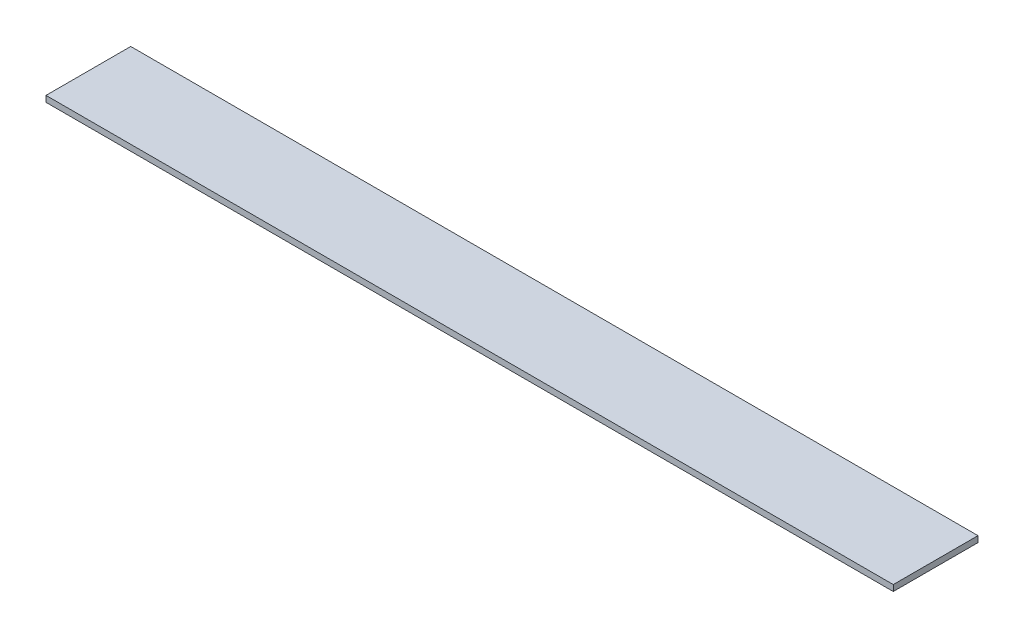
ISO-10303-21;
HEADER;
FILE_DESCRIPTION(('STEP AP214'),'2;1');
FILE_NAME('part.step','',(''),(''),'','','');
FILE_SCHEMA(('AUTOMOTIVE_DESIGN { 1 0 10303 214 1 1 1 1 }'));
ENDSEC;
DATA;
#1=APPLICATION_CONTEXT('core data for automotive mechanical design processes');
#2=APPLICATION_PROTOCOL_DEFINITION('international standard','automotive_design',2000,#1);
#3=PRODUCT_CONTEXT('',#1,'mechanical');
#4=PRODUCT('Part','Part','',(#3));
#5=PRODUCT_RELATED_PRODUCT_CATEGORY('part','',(#4));
#6=PRODUCT_DEFINITION_FORMATION('','',#4);
#7=PRODUCT_DEFINITION_CONTEXT('part definition',#1,'design');
#8=PRODUCT_DEFINITION('design','',#6,#7);
#9=PRODUCT_DEFINITION_SHAPE('','',#8);
#10=(LENGTH_UNIT() NAMED_UNIT(*) SI_UNIT(.MILLI.,.METRE.));
#11=(NAMED_UNIT(*) PLANE_ANGLE_UNIT() SI_UNIT($,.RADIAN.));
#12=(NAMED_UNIT(*) SI_UNIT($,.STERADIAN.) SOLID_ANGLE_UNIT());
#13=UNCERTAINTY_MEASURE_WITH_UNIT(LENGTH_MEASURE(1.E-05),#10,'distance_accuracy_value','');
#14=(GEOMETRIC_REPRESENTATION_CONTEXT(3) GLOBAL_UNCERTAINTY_ASSIGNED_CONTEXT((#13)) GLOBAL_UNIT_ASSIGNED_CONTEXT((#10,
#11,#12)) REPRESENTATION_CONTEXT('',''));
#15=CARTESIAN_POINT('',(0.,0.,0.));
#16=DIRECTION('',(0.,0.,1.));
#17=DIRECTION('',(1.,0.,0.));
#18=AXIS2_PLACEMENT_3D('',#15,#16,#17);
#19=CARTESIAN_POINT('',(1400.,0.,0.));
#20=DIRECTION('',(0.,0.,-1.));
#21=DIRECTION('',(0.,1.,0.));
#22=AXIS2_PLACEMENT_3D('',#19,#20,#21);
#23=PLANE('',#22);
#24=DIRECTION('',(0.,-1.,0.));
#25=VECTOR('',#24,1.);
#26=CARTESIAN_POINT('',(0.,0.,0.));
#27=LINE('',#26,#25);
#28=CARTESIAN_POINT('',(0.,0.,0.));
#29=VERTEX_POINT('',#28);
#30=CARTESIAN_POINT('',(0.,-10.,0.));
#31=VERTEX_POINT('',#30);
#32=EDGE_CURVE('E107',#29,#31,#27,.T.);
#33=ORIENTED_EDGE('',*,*,#32,.T.);
#34=DIRECTION('',(-1.,0.,0.));
#35=VECTOR('',#34,1.);
#36=CARTESIAN_POINT('',(1400.,-10.,0.));
#37=LINE('',#36,#35);
#38=CARTESIAN_POINT('',(1400.,-10.,0.));
#39=VERTEX_POINT('',#38);
#40=EDGE_CURVE('E11',#39,#31,#37,.T.);
#41=ORIENTED_EDGE('',*,*,#40,.F.);
#42=DIRECTION('',(0.,-1.,0.));
#43=VECTOR('',#42,1.);
#44=CARTESIAN_POINT('',(1400.,0.,0.));
#45=LINE('',#44,#43);
#46=CARTESIAN_POINT('',(1400.,0.,0.));
#47=VERTEX_POINT('',#46);
#48=EDGE_CURVE('E89',#47,#39,#45,.T.);
#49=ORIENTED_EDGE('',*,*,#48,.F.);
#50=DIRECTION('',(-1.,0.,0.));
#51=VECTOR('',#50,1.);
#52=CARTESIAN_POINT('',(1400.,0.,0.));
#53=LINE('',#52,#51);
#54=EDGE_CURVE('E56',#47,#29,#53,.T.);
#55=ORIENTED_EDGE('',*,*,#54,.T.);
#56=EDGE_LOOP('',(#33,#41,#49,#55));
#57=FACE_BOUND('',#56,.T.);
#58=ADVANCED_FACE('F39',(#57),#23,.F.);
#59=CARTESIAN_POINT('',(1400.,-10.,0.));
#60=DIRECTION('',(0.,1.,0.));
#61=DIRECTION('',(0.,0.,1.));
#62=AXIS2_PLACEMENT_3D('',#59,#60,#61);
#63=PLANE('',#62);
#64=DIRECTION('',(0.,0.,-1.));
#65=VECTOR('',#64,1.);
#66=CARTESIAN_POINT('',(0.,-10.,0.));
#67=LINE('',#66,#65);
#68=CARTESIAN_POINT('',(0.,-10.,-140.));
#69=VERTEX_POINT('',#68);
#70=EDGE_CURVE('E95',#31,#69,#67,.T.);
#71=ORIENTED_EDGE('',*,*,#70,.T.);
#72=DIRECTION('',(-1.,0.,0.));
#73=VECTOR('',#72,1.);
#74=CARTESIAN_POINT('',(1400.,-10.,-140.));
#75=LINE('',#74,#73);
#76=CARTESIAN_POINT('',(1400.,-10.,-140.));
#77=VERTEX_POINT('',#76);
#78=EDGE_CURVE('E48',#77,#69,#75,.T.);
#79=ORIENTED_EDGE('',*,*,#78,.F.);
#80=DIRECTION('',(0.,0.,-1.));
#81=VECTOR('',#80,1.);
#82=CARTESIAN_POINT('',(1400.,-10.,0.));
#83=LINE('',#82,#81);
#84=EDGE_CURVE('E81',#39,#77,#83,.T.);
#85=ORIENTED_EDGE('',*,*,#84,.F.);
#86=ORIENTED_EDGE('',*,*,#40,.T.);
#87=EDGE_LOOP('',(#71,#79,#85,#86));
#88=FACE_BOUND('',#87,.T.);
#89=ADVANCED_FACE('F94',(#88),#63,.F.);
#90=CARTESIAN_POINT('',(1400.,0.,-140.));
#91=DIRECTION('',(0.,0.,-1.));
#92=DIRECTION('',(-1.,0.,0.));
#93=AXIS2_PLACEMENT_3D('',#90,#91,#92);
#94=PLANE('',#93);
#95=DIRECTION('',(0.,-1.,0.));
#96=VECTOR('',#95,1.);
#97=CARTESIAN_POINT('',(0.,0.,-140.));
#98=LINE('',#97,#96);
#99=CARTESIAN_POINT('',(0.,0.,-140.));
#100=VERTEX_POINT('',#99);
#101=EDGE_CURVE('E112',#100,#69,#98,.T.);
#102=ORIENTED_EDGE('',*,*,#101,.F.);
#103=DIRECTION('',(-1.,0.,0.));
#104=VECTOR('',#103,1.);
#105=CARTESIAN_POINT('',(1400.,0.,-140.));
#106=LINE('',#105,#104);
#107=CARTESIAN_POINT('',(1400.,0.,-140.));
#108=VERTEX_POINT('',#107);
#109=EDGE_CURVE('E70',#108,#100,#106,.T.);
#110=ORIENTED_EDGE('',*,*,#109,.F.);
#111=DIRECTION('',(0.,-1.,0.));
#112=VECTOR('',#111,1.);
#113=CARTESIAN_POINT('',(1400.,0.,-140.));
#114=LINE('',#113,#112);
#115=EDGE_CURVE('E88',#108,#77,#114,.T.);
#116=ORIENTED_EDGE('',*,*,#115,.T.);
#117=ORIENTED_EDGE('',*,*,#78,.T.);
#118=EDGE_LOOP('',(#102,#110,#116,#117));
#119=FACE_BOUND('',#118,.T.);
#120=ADVANCED_FACE('F99',(#119),#94,.T.);
#121=CARTESIAN_POINT('',(1400.,0.,0.));
#122=DIRECTION('',(0.,1.,0.));
#123=DIRECTION('',(0.,0.,1.));
#124=AXIS2_PLACEMENT_3D('',#121,#122,#123);
#125=PLANE('',#124);
#126=DIRECTION('',(0.,0.,-1.));
#127=VECTOR('',#126,1.);
#128=CARTESIAN_POINT('',(0.,0.,0.));
#129=LINE('',#128,#127);
#130=EDGE_CURVE('E115',#29,#100,#129,.T.);
#131=ORIENTED_EDGE('',*,*,#130,.F.);
#132=ORIENTED_EDGE('',*,*,#54,.F.);
#133=DIRECTION('',(0.,0.,-1.));
#134=VECTOR('',#133,1.);
#135=CARTESIAN_POINT('',(1400.,0.,0.));
#136=LINE('',#135,#134);
#137=EDGE_CURVE('E101',#47,#108,#136,.T.);
#138=ORIENTED_EDGE('',*,*,#137,.T.);
#139=ORIENTED_EDGE('',*,*,#109,.T.);
#140=EDGE_LOOP('',(#131,#132,#138,#139));
#141=FACE_BOUND('',#140,.T.);
#142=ADVANCED_FACE('F125',(#141),#125,.T.);
#143=CARTESIAN_POINT('',(1400.,0.,0.));
#144=DIRECTION('',(1.,0.,0.));
#145=DIRECTION('',(0.,0.,-1.));
#146=AXIS2_PLACEMENT_3D('',#143,#144,#145);
#147=PLANE('',#146);
#148=ORIENTED_EDGE('',*,*,#48,.T.);
#149=ORIENTED_EDGE('',*,*,#84,.T.);
#150=ORIENTED_EDGE('',*,*,#115,.F.);
#151=ORIENTED_EDGE('',*,*,#137,.F.);
#152=EDGE_LOOP('',(#148,#149,#150,#151));
#153=FACE_BOUND('',#152,.T.);
#154=ADVANCED_FACE('F85',(#153),#147,.T.);
#155=CARTESIAN_POINT('',(0.,0.,0.));
#156=DIRECTION('',(1.,0.,0.));
#157=DIRECTION('',(0.,0.,-1.));
#158=AXIS2_PLACEMENT_3D('',#155,#156,#157);
#159=PLANE('',#158);
#160=ORIENTED_EDGE('',*,*,#32,.F.);
#161=ORIENTED_EDGE('',*,*,#130,.T.);
#162=ORIENTED_EDGE('',*,*,#101,.T.);
#163=ORIENTED_EDGE('',*,*,#70,.F.);
#164=EDGE_LOOP('',(#160,#161,#162,#163));
#165=FACE_BOUND('',#164,.T.);
#166=ADVANCED_FACE('F124',(#165),#159,.F.);
#167=CLOSED_SHELL('',(#58,#89,#120,#142,#154,#166));
#168=MANIFOLD_SOLID_BREP('B2',#167);
#169=ADVANCED_BREP_SHAPE_REPRESENTATION('',(#18,#168),#14);
#170=SHAPE_DEFINITION_REPRESENTATION(#9,#169);
ENDSEC;
END-ISO-10303-21;
